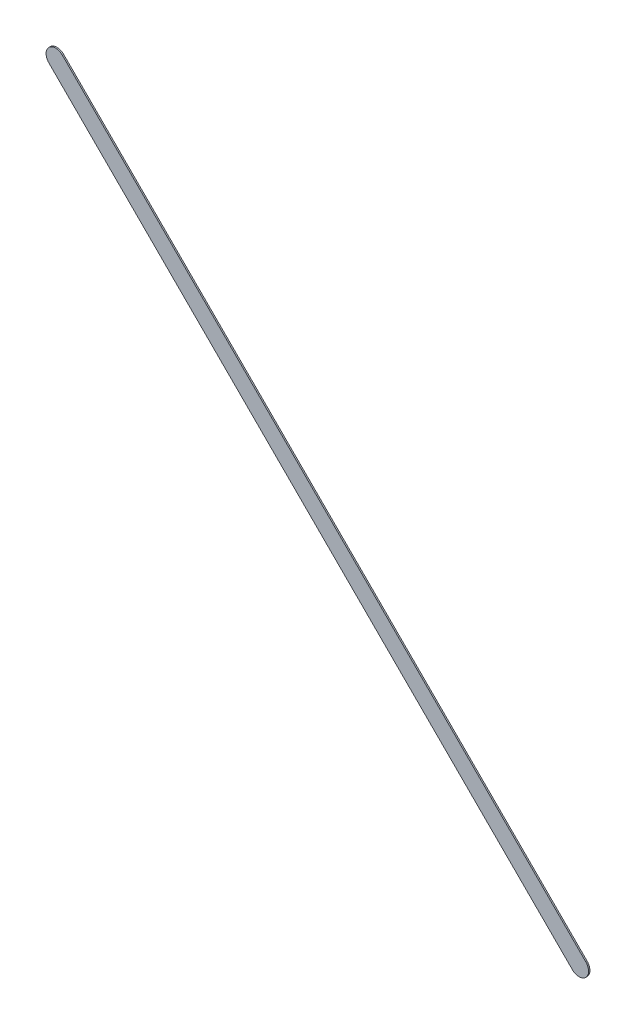
ISO-10303-21;
HEADER;
FILE_DESCRIPTION(('STEP AP214'),'2;1');
FILE_NAME('part.step','',(''),(''),'','','');
FILE_SCHEMA(('AUTOMOTIVE_DESIGN { 1 0 10303 214 1 1 1 1 }'));
ENDSEC;
DATA;
#1=APPLICATION_CONTEXT('core data for automotive mechanical design processes');
#2=APPLICATION_PROTOCOL_DEFINITION('international standard','automotive_design',2000,#1);
#3=PRODUCT_CONTEXT('',#1,'mechanical');
#4=PRODUCT('Part','Part','',(#3));
#5=PRODUCT_RELATED_PRODUCT_CATEGORY('part','',(#4));
#6=PRODUCT_DEFINITION_FORMATION('','',#4);
#7=PRODUCT_DEFINITION_CONTEXT('part definition',#1,'design');
#8=PRODUCT_DEFINITION('design','',#6,#7);
#9=PRODUCT_DEFINITION_SHAPE('','',#8);
#10=(LENGTH_UNIT() NAMED_UNIT(*) SI_UNIT(.MILLI.,.METRE.));
#11=(NAMED_UNIT(*) PLANE_ANGLE_UNIT() SI_UNIT($,.RADIAN.));
#12=(NAMED_UNIT(*) SI_UNIT($,.STERADIAN.) SOLID_ANGLE_UNIT());
#13=UNCERTAINTY_MEASURE_WITH_UNIT(LENGTH_MEASURE(1.E-05),#10,'distance_accuracy_value','');
#14=(GEOMETRIC_REPRESENTATION_CONTEXT(3) GLOBAL_UNCERTAINTY_ASSIGNED_CONTEXT((#13)) GLOBAL_UNIT_ASSIGNED_CONTEXT((#10,
#11,#12)) REPRESENTATION_CONTEXT('',''));
#15=CARTESIAN_POINT('',(0.,0.,0.));
#16=DIRECTION('',(0.,0.,1.));
#17=DIRECTION('',(1.,0.,0.));
#18=AXIS2_PLACEMENT_3D('',#15,#16,#17);
#19=CARTESIAN_POINT('',(80.07724396,66.46920412,0.));
#20=DIRECTION('',(0.707106781186547,0.707106781186548,0.));
#21=DIRECTION('',(0.707106781186548,-0.707106781186547,0.));
#22=AXIS2_PLACEMENT_3D('',#19,#20,#21);
#23=PLANE('',#22);
#24=DIRECTION('',(0.707106781186548,-0.707106781186547,0.));
#25=VECTOR('',#24,1.);
#26=CARTESIAN_POINT('',(80.07724396,66.46920412,0.03556));
#27=LINE('',#26,#25);
#28=CARTESIAN_POINT('',(80.07724396,66.46920412,0.03556));
#29=VERTEX_POINT('',#28);
#30=CARTESIAN_POINT('',(93.82995966,52.71648842,0.03556));
#31=VERTEX_POINT('',#30);
#32=EDGE_CURVE('E11',#29,#31,#27,.T.);
#33=ORIENTED_EDGE('',*,*,#32,.F.);
#34=DIRECTION('',(0.,0.,1.));
#35=VECTOR('',#34,1.);
#36=CARTESIAN_POINT('',(80.07724396,66.46920412,0.));
#37=LINE('',#36,#35);
#38=CARTESIAN_POINT('',(80.07724396,66.46920412,0.));
#39=VERTEX_POINT('',#38);
#40=EDGE_CURVE('E24',#39,#29,#37,.T.);
#41=ORIENTED_EDGE('',*,*,#40,.F.);
#42=DIRECTION('',(0.707106781186548,-0.707106781186547,0.));
#43=VECTOR('',#42,1.);
#44=CARTESIAN_POINT('',(80.07724396,66.46920412,0.));
#45=LINE('',#44,#43);
#46=CARTESIAN_POINT('',(93.82995966,52.71648842,0.));
#47=VERTEX_POINT('',#46);
#48=EDGE_CURVE('E75',#39,#47,#45,.T.);
#49=ORIENTED_EDGE('',*,*,#48,.T.);
#50=DIRECTION('',(0.,0.,1.));
#51=VECTOR('',#50,1.);
#52=CARTESIAN_POINT('',(93.82995966,52.71648842,0.));
#53=LINE('',#52,#51);
#54=EDGE_CURVE('E37',#47,#31,#53,.T.);
#55=ORIENTED_EDGE('',*,*,#54,.T.);
#56=EDGE_LOOP('',(#33,#41,#49,#55));
#57=FACE_BOUND('',#56,.T.);
#58=ADVANCED_FACE('F17',(#57),#23,.F.);
#59=CARTESIAN_POINT('',(94.00673604,52.8932648,0.));
#60=DIRECTION('',(0.,0.,-1.));
#61=DIRECTION('',(-0.707106781186533,-0.707106781186562,0.));
#62=AXIS2_PLACEMENT_3D('',#59,#60,#61);
#63=CYLINDRICAL_SURFACE('',#62,0.249999554103221);
#64=CARTESIAN_POINT('',(94.00673604,52.8932648,0.03556));
#65=DIRECTION('',(0.,0.,1.));
#66=DIRECTION('',(-0.707106781186533,-0.707106781186562,0.));
#67=AXIS2_PLACEMENT_3D('',#64,#65,#66);
#68=CIRCLE('',#67,0.249999554103221);
#69=CARTESIAN_POINT('',(94.18351242,53.07004118,0.03556));
#70=VERTEX_POINT('',#69);
#71=EDGE_CURVE('E83',#31,#70,#68,.T.);
#72=ORIENTED_EDGE('',*,*,#71,.F.);
#73=ORIENTED_EDGE('',*,*,#54,.F.);
#74=CARTESIAN_POINT('',(94.00673604,52.8932648,0.));
#75=DIRECTION('',(0.,0.,1.));
#76=DIRECTION('',(-0.707106781186533,-0.707106781186562,0.));
#77=AXIS2_PLACEMENT_3D('',#74,#75,#76);
#78=CIRCLE('',#77,0.249999554103221);
#79=CARTESIAN_POINT('',(94.18351242,53.07004118,0.));
#80=VERTEX_POINT('',#79);
#81=EDGE_CURVE('E81',#47,#80,#78,.T.);
#82=ORIENTED_EDGE('',*,*,#81,.T.);
#83=DIRECTION('',(0.,0.,1.));
#84=VECTOR('',#83,1.);
#85=CARTESIAN_POINT('',(94.18351242,53.07004118,0.));
#86=LINE('',#85,#84);
#87=EDGE_CURVE('E67',#80,#70,#86,.T.);
#88=ORIENTED_EDGE('',*,*,#87,.T.);
#89=EDGE_LOOP('',(#72,#73,#82,#88));
#90=FACE_BOUND('',#89,.T.);
#91=ADVANCED_FACE('F89',(#90),#63,.T.);
#92=CARTESIAN_POINT('',(94.18351242,53.07004118,0.));
#93=DIRECTION('',(-0.707106781186547,-0.707106781186548,0.));
#94=DIRECTION('',(-0.707106781186548,0.707106781186547,0.));
#95=AXIS2_PLACEMENT_3D('',#92,#93,#94);
#96=PLANE('',#95);
#97=DIRECTION('',(-0.707106781186548,0.707106781186547,0.));
#98=VECTOR('',#97,1.);
#99=CARTESIAN_POINT('',(94.18351242,53.07004118,0.03556));
#100=LINE('',#99,#98);
#101=CARTESIAN_POINT('',(80.43079672,66.82275688,0.03556));
#102=VERTEX_POINT('',#101);
#103=EDGE_CURVE('E71',#70,#102,#100,.T.);
#104=ORIENTED_EDGE('',*,*,#103,.F.);
#105=ORIENTED_EDGE('',*,*,#87,.F.);
#106=DIRECTION('',(-0.707106781186548,0.707106781186547,0.));
#107=VECTOR('',#106,1.);
#108=CARTESIAN_POINT('',(94.18351242,53.07004118,0.));
#109=LINE('',#108,#107);
#110=CARTESIAN_POINT('',(80.43079672,66.82275688,0.));
#111=VERTEX_POINT('',#110);
#112=EDGE_CURVE('E63',#80,#111,#109,.T.);
#113=ORIENTED_EDGE('',*,*,#112,.T.);
#114=DIRECTION('',(0.,0.,1.));
#115=VECTOR('',#114,1.);
#116=CARTESIAN_POINT('',(80.43079672,66.82275688,0.));
#117=LINE('',#116,#115);
#118=EDGE_CURVE('E53',#111,#102,#117,.T.);
#119=ORIENTED_EDGE('',*,*,#118,.T.);
#120=EDGE_LOOP('',(#104,#105,#113,#119));
#121=FACE_BOUND('',#120,.T.);
#122=ADVANCED_FACE('F66',(#121),#96,.F.);
#123=CARTESIAN_POINT('',(80.25402034,66.6459805,0.));
#124=DIRECTION('',(0.,0.,-1.));
#125=DIRECTION('',(0.707106781186576,0.707106781186519,0.));
#126=AXIS2_PLACEMENT_3D('',#123,#124,#125);
#127=CYLINDRICAL_SURFACE('',#126,0.249999554103216);
#128=CARTESIAN_POINT('',(80.25402034,66.6459805,0.03556));
#129=DIRECTION('',(0.,0.,1.));
#130=DIRECTION('',(0.707106781186576,0.707106781186519,0.));
#131=AXIS2_PLACEMENT_3D('',#128,#129,#130);
#132=CIRCLE('',#131,0.249999554103216);
#133=EDGE_CURVE('E59',#102,#29,#132,.T.);
#134=ORIENTED_EDGE('',*,*,#133,.F.);
#135=ORIENTED_EDGE('',*,*,#118,.F.);
#136=CARTESIAN_POINT('',(80.25402034,66.6459805,0.));
#137=DIRECTION('',(0.,0.,1.));
#138=DIRECTION('',(0.707106781186576,0.707106781186519,0.));
#139=AXIS2_PLACEMENT_3D('',#136,#137,#138);
#140=CIRCLE('',#139,0.249999554103216);
#141=EDGE_CURVE('E57',#111,#39,#140,.T.);
#142=ORIENTED_EDGE('',*,*,#141,.T.);
#143=ORIENTED_EDGE('',*,*,#40,.T.);
#144=EDGE_LOOP('',(#134,#135,#142,#143));
#145=FACE_BOUND('',#144,.T.);
#146=ADVANCED_FACE('F55',(#145),#127,.T.);
#147=CARTESIAN_POINT('',(80.07724396,66.46920412,0.));
#148=DIRECTION('',(0.,0.,-1.));
#149=DIRECTION('',(-1.,0.,0.));
#150=AXIS2_PLACEMENT_3D('',#147,#148,#149);
#151=PLANE('',#150);
#152=ORIENTED_EDGE('',*,*,#141,.F.);
#153=ORIENTED_EDGE('',*,*,#112,.F.);
#154=ORIENTED_EDGE('',*,*,#81,.F.);
#155=ORIENTED_EDGE('',*,*,#48,.F.);
#156=EDGE_LOOP('',(#152,#153,#154,#155));
#157=FACE_BOUND('',#156,.T.);
#158=ADVANCED_FACE('F74',(#157),#151,.T.);
#159=CARTESIAN_POINT('',(80.07724396,66.46920412,0.03556));
#160=DIRECTION('',(0.,0.,-1.));
#161=DIRECTION('',(-1.,0.,0.));
#162=AXIS2_PLACEMENT_3D('',#159,#160,#161);
#163=PLANE('',#162);
#164=ORIENTED_EDGE('',*,*,#32,.T.);
#165=ORIENTED_EDGE('',*,*,#71,.T.);
#166=ORIENTED_EDGE('',*,*,#103,.T.);
#167=ORIENTED_EDGE('',*,*,#133,.T.);
#168=EDGE_LOOP('',(#164,#165,#166,#167));
#169=FACE_BOUND('',#168,.T.);
#170=ADVANCED_FACE('F91',(#169),#163,.F.);
#171=CLOSED_SHELL('',(#58,#91,#122,#146,#158,#170));
#172=MANIFOLD_SOLID_BREP('B1',#171);
#173=ADVANCED_BREP_SHAPE_REPRESENTATION('',(#18,#172),#14);
#174=SHAPE_DEFINITION_REPRESENTATION(#9,#173);
ENDSEC;
END-ISO-10303-21;
